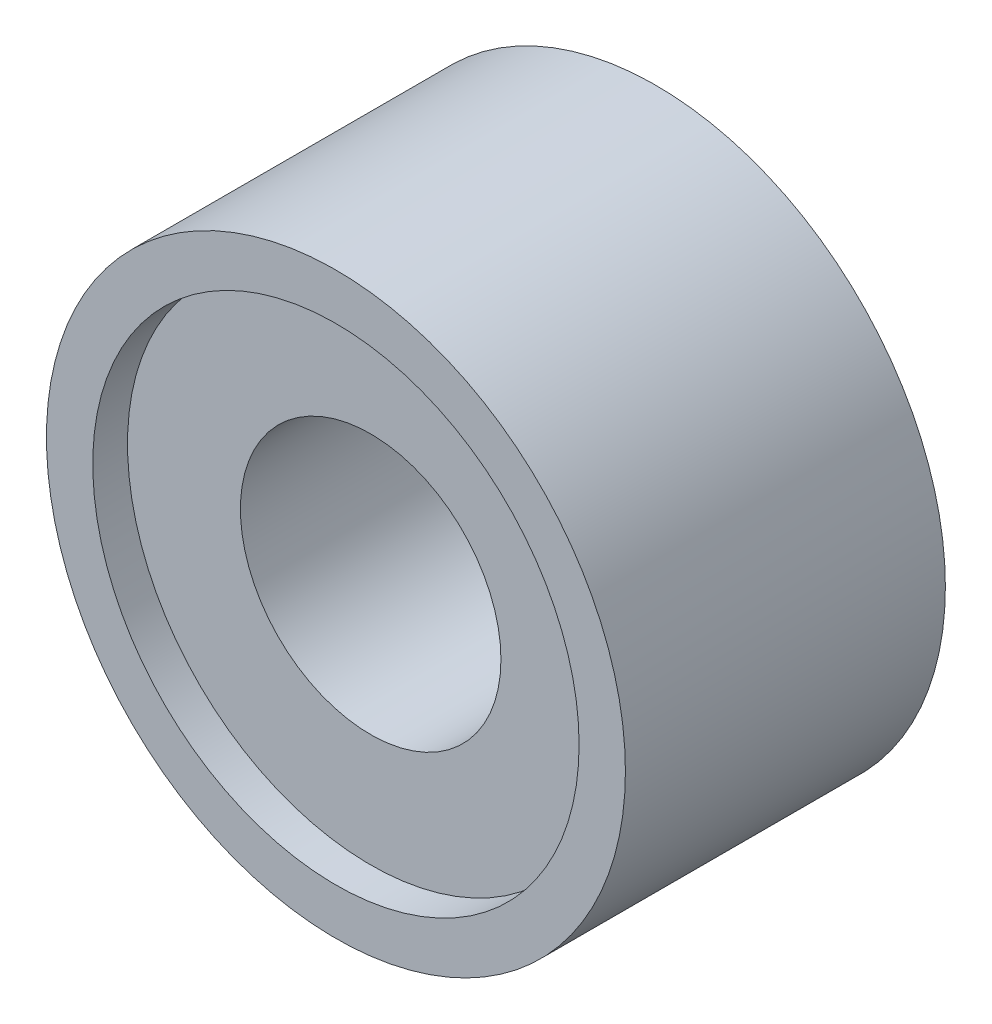
ISO-10303-21;
HEADER;
FILE_DESCRIPTION(('STEP AP214'),'2;1');
FILE_NAME('part.step','',(''),(''),'','','');
FILE_SCHEMA(('AUTOMOTIVE_DESIGN { 1 0 10303 214 1 1 1 1 }'));
ENDSEC;
DATA;
#1=APPLICATION_CONTEXT('core data for automotive mechanical design processes');
#2=APPLICATION_PROTOCOL_DEFINITION('international standard','automotive_design',2000,#1);
#3=PRODUCT_CONTEXT('',#1,'mechanical');
#4=PRODUCT('Part','Part','',(#3));
#5=PRODUCT_RELATED_PRODUCT_CATEGORY('part','',(#4));
#6=PRODUCT_DEFINITION_FORMATION('','',#4);
#7=PRODUCT_DEFINITION_CONTEXT('part definition',#1,'design');
#8=PRODUCT_DEFINITION('design','',#6,#7);
#9=PRODUCT_DEFINITION_SHAPE('','',#8);
#10=(LENGTH_UNIT() NAMED_UNIT(*) SI_UNIT(.MILLI.,.METRE.));
#11=(NAMED_UNIT(*) PLANE_ANGLE_UNIT() SI_UNIT($,.RADIAN.));
#12=(NAMED_UNIT(*) SI_UNIT($,.STERADIAN.) SOLID_ANGLE_UNIT());
#13=UNCERTAINTY_MEASURE_WITH_UNIT(LENGTH_MEASURE(1.E-05),#10,'distance_accuracy_value','');
#14=(GEOMETRIC_REPRESENTATION_CONTEXT(3) GLOBAL_UNCERTAINTY_ASSIGNED_CONTEXT((#13)) GLOBAL_UNIT_ASSIGNED_CONTEXT((#10,
#11,#12)) REPRESENTATION_CONTEXT('',''));
#15=CARTESIAN_POINT('',(0.,0.,0.));
#16=DIRECTION('',(0.,0.,1.));
#17=DIRECTION('',(1.,0.,0.));
#18=AXIS2_PLACEMENT_3D('',#15,#16,#17);
#19=CARTESIAN_POINT('',(0.,0.,-27.632411408023));
#20=DIRECTION('',(0.,0.,1.));
#21=DIRECTION('',(1.,0.,0.));
#22=AXIS2_PLACEMENT_3D('',#19,#20,#21);
#23=CYLINDRICAL_SURFACE('',#22,11.25);
#24=CARTESIAN_POINT('',(0.,0.,-27.632411408023));
#25=DIRECTION('',(0.,0.,1.));
#26=DIRECTION('',(1.,0.,0.));
#27=AXIS2_PLACEMENT_3D('',#24,#25,#26);
#28=CIRCLE('',#27,11.25);
#29=CARTESIAN_POINT('',(11.25,0.,-27.632411408023));
#30=VERTEX_POINT('',#29);
#31=EDGE_CURVE('E46',#30,#30,#28,.T.);
#32=ORIENTED_EDGE('',*,*,#31,.F.);
#33=EDGE_LOOP('',(#32));
#34=FACE_BOUND('',#33,.T.);
#35=CARTESIAN_POINT('',(0.,0.,-3.));
#36=DIRECTION('',(0.,0.,1.));
#37=DIRECTION('',(1.,0.,0.));
#38=AXIS2_PLACEMENT_3D('',#35,#36,#37);
#39=CIRCLE('',#38,11.25);
#40=CARTESIAN_POINT('',(11.25,0.,-3.));
#41=VERTEX_POINT('',#40);
#42=EDGE_CURVE('E38',#41,#41,#39,.F.);
#43=ORIENTED_EDGE('',*,*,#42,.F.);
#44=EDGE_LOOP('',(#43));
#45=FACE_BOUND('',#44,.T.);
#46=ADVANCED_FACE('F34',(#34,#45),#23,.F.);
#47=CARTESIAN_POINT('',(0.,0.,45.8850134390107));
#48=DIRECTION('',(0.,0.,1.));
#49=DIRECTION('',(1.,0.,0.));
#50=AXIS2_PLACEMENT_3D('',#47,#48,#49);
#51=CYLINDRICAL_SURFACE('',#50,25.);
#52=CARTESIAN_POINT('',(0.,0.,0.));
#53=DIRECTION('',(0.,0.,1.));
#54=DIRECTION('',(1.,0.,0.));
#55=AXIS2_PLACEMENT_3D('',#52,#53,#54);
#56=CIRCLE('',#55,25.);
#57=CARTESIAN_POINT('',(25.,0.,0.));
#58=VERTEX_POINT('',#57);
#59=EDGE_CURVE('E42',#58,#58,#56,.T.);
#60=ORIENTED_EDGE('',*,*,#59,.F.);
#61=EDGE_LOOP('',(#60));
#62=FACE_BOUND('',#61,.T.);
#63=CARTESIAN_POINT('',(0.,0.,-27.632411408023));
#64=DIRECTION('',(0.,0.,1.));
#65=DIRECTION('',(1.,0.,0.));
#66=AXIS2_PLACEMENT_3D('',#63,#64,#65);
#67=CIRCLE('',#66,25.);
#68=CARTESIAN_POINT('',(25.,0.,-27.632411408023));
#69=VERTEX_POINT('',#68);
#70=EDGE_CURVE('E10',#69,#69,#67,.T.);
#71=ORIENTED_EDGE('',*,*,#70,.T.);
#72=EDGE_LOOP('',(#71));
#73=FACE_BOUND('',#72,.T.);
#74=ADVANCED_FACE('F36',(#62,#73),#51,.T.);
#75=CARTESIAN_POINT('',(0.,0.,-27.632411408023));
#76=DIRECTION('',(0.,0.,1.));
#77=DIRECTION('',(1.,0.,0.));
#78=AXIS2_PLACEMENT_3D('',#75,#76,#77);
#79=PLANE('',#78);
#80=ORIENTED_EDGE('',*,*,#31,.T.);
#81=EDGE_LOOP('',(#80));
#82=FACE_BOUND('',#81,.T.);
#83=ORIENTED_EDGE('',*,*,#70,.F.);
#84=EDGE_LOOP('',(#83));
#85=FACE_BOUND('',#84,.T.);
#86=ADVANCED_FACE('F69',(#82,#85),#79,.F.);
#87=CARTESIAN_POINT('',(0.,0.,0.));
#88=DIRECTION('',(0.,0.,1.));
#89=DIRECTION('',(1.,0.,0.));
#90=AXIS2_PLACEMENT_3D('',#87,#88,#89);
#91=PLANE('',#90);
#92=CARTESIAN_POINT('',(0.,0.,0.));
#93=DIRECTION('',(0.,0.,1.));
#94=DIRECTION('',(1.,0.,0.));
#95=AXIS2_PLACEMENT_3D('',#92,#93,#94);
#96=CIRCLE('',#95,21.);
#97=CARTESIAN_POINT('',(21.,0.,0.));
#98=VERTEX_POINT('',#97);
#99=EDGE_CURVE('E51',#98,#98,#96,.T.);
#100=ORIENTED_EDGE('',*,*,#99,.F.);
#101=EDGE_LOOP('',(#100));
#102=FACE_BOUND('',#101,.T.);
#103=ORIENTED_EDGE('',*,*,#59,.T.);
#104=EDGE_LOOP('',(#103));
#105=FACE_BOUND('',#104,.T.);
#106=ADVANCED_FACE('F76',(#102,#105),#91,.T.);
#107=CARTESIAN_POINT('',(0.,0.,-3.));
#108=DIRECTION('',(0.,0.,1.));
#109=DIRECTION('',(1.,0.,0.));
#110=AXIS2_PLACEMENT_3D('',#107,#108,#109);
#111=PLANE('',#110);
#112=CARTESIAN_POINT('',(0.,0.,-3.));
#113=DIRECTION('',(0.,0.,1.));
#114=DIRECTION('',(1.,0.,0.));
#115=AXIS2_PLACEMENT_3D('',#112,#113,#114);
#116=CIRCLE('',#115,21.);
#117=CARTESIAN_POINT('',(21.,0.,-3.));
#118=VERTEX_POINT('',#117);
#119=EDGE_CURVE('E54',#118,#118,#116,.T.);
#120=ORIENTED_EDGE('',*,*,#119,.T.);
#121=EDGE_LOOP('',(#120));
#122=FACE_BOUND('',#121,.T.);
#123=ORIENTED_EDGE('',*,*,#42,.T.);
#124=EDGE_LOOP('',(#123));
#125=FACE_BOUND('',#124,.T.);
#126=ADVANCED_FACE('F61',(#122,#125),#111,.T.);
#127=CARTESIAN_POINT('',(0.,0.,-3.));
#128=DIRECTION('',(0.,0.,1.));
#129=DIRECTION('',(1.,0.,0.));
#130=AXIS2_PLACEMENT_3D('',#127,#128,#129);
#131=CYLINDRICAL_SURFACE('',#130,21.);
#132=ORIENTED_EDGE('',*,*,#119,.F.);
#133=EDGE_LOOP('',(#132));
#134=FACE_BOUND('',#133,.T.);
#135=ORIENTED_EDGE('',*,*,#99,.T.);
#136=EDGE_LOOP('',(#135));
#137=FACE_BOUND('',#136,.T.);
#138=ADVANCED_FACE('F74',(#134,#137),#131,.F.);
#139=CLOSED_SHELL('',(#46,#74,#86,#106,#126,#138));
#140=MANIFOLD_SOLID_BREP('B2',#139);
#141=ADVANCED_BREP_SHAPE_REPRESENTATION('',(#18,#140),#14);
#142=SHAPE_DEFINITION_REPRESENTATION(#9,#141);
ENDSEC;
END-ISO-10303-21;
